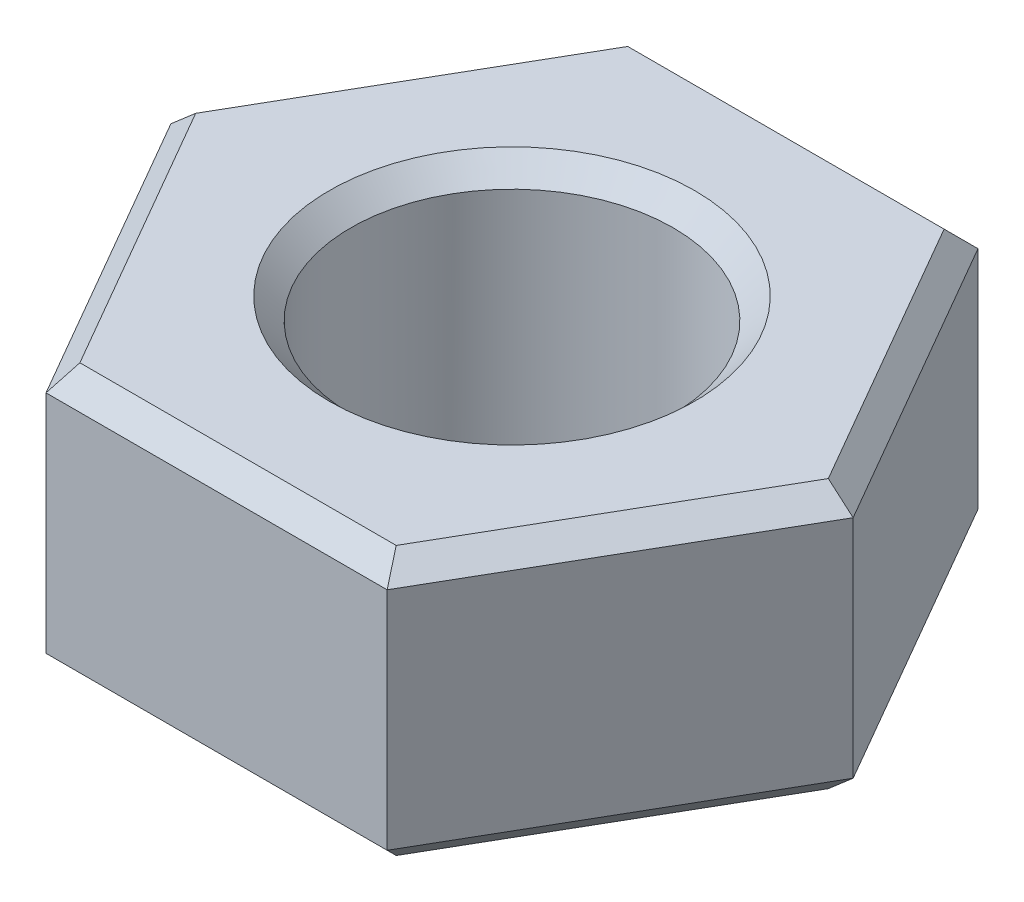
ISO-10303-21;
HEADER;
FILE_DESCRIPTION(('STEP AP214'),'2;1');
FILE_NAME('part.step','',(''),(''),'','','');
FILE_SCHEMA(('AUTOMOTIVE_DESIGN { 1 0 10303 214 1 1 1 1 }'));
ENDSEC;
DATA;
#1=APPLICATION_CONTEXT('core data for automotive mechanical design processes');
#2=APPLICATION_PROTOCOL_DEFINITION('international standard','automotive_design',2000,#1);
#3=PRODUCT_CONTEXT('',#1,'mechanical');
#4=PRODUCT('Part','Part','',(#3));
#5=PRODUCT_RELATED_PRODUCT_CATEGORY('part','',(#4));
#6=PRODUCT_DEFINITION_FORMATION('','',#4);
#7=PRODUCT_DEFINITION_CONTEXT('part definition',#1,'design');
#8=PRODUCT_DEFINITION('design','',#6,#7);
#9=PRODUCT_DEFINITION_SHAPE('','',#8);
#10=(LENGTH_UNIT() NAMED_UNIT(*) SI_UNIT(.MILLI.,.METRE.));
#11=(NAMED_UNIT(*) PLANE_ANGLE_UNIT() SI_UNIT($,.RADIAN.));
#12=(NAMED_UNIT(*) SI_UNIT($,.STERADIAN.) SOLID_ANGLE_UNIT());
#13=UNCERTAINTY_MEASURE_WITH_UNIT(LENGTH_MEASURE(1.E-05),#10,'distance_accuracy_value','');
#14=(GEOMETRIC_REPRESENTATION_CONTEXT(3) GLOBAL_UNCERTAINTY_ASSIGNED_CONTEXT((#13)) GLOBAL_UNIT_ASSIGNED_CONTEXT((#10,
#11,#12)) REPRESENTATION_CONTEXT('',''));
#15=CARTESIAN_POINT('',(0.,0.,0.));
#16=DIRECTION('',(0.,0.,1.));
#17=DIRECTION('',(1.,0.,0.));
#18=AXIS2_PLACEMENT_3D('',#15,#16,#17);
#19=CARTESIAN_POINT('',(0.,2.5,0.));
#20=DIRECTION('',(0.,1.,0.));
#21=DIRECTION('',(0.,0.,1.));
#22=AXIS2_PLACEMENT_3D('',#19,#20,#21);
#23=PLANE('',#22);
#24=CARTESIAN_POINT('',(0.,2.5,0.));
#25=DIRECTION('',(0.,1.,0.));
#26=DIRECTION('',(0.,0.,1.));
#27=AXIS2_PLACEMENT_3D('',#24,#25,#26);
#28=CIRCLE('',#27,1.7);
#29=CARTESIAN_POINT('',(0.,2.5,1.7));
#30=VERTEX_POINT('',#29);
#31=EDGE_CURVE('E11',#30,#30,#28,.F.);
#32=ORIENTED_EDGE('',*,*,#31,.T.);
#33=EDGE_LOOP('',(#32));
#34=FACE_BOUND('',#33,.T.);
#35=DIRECTION('',(0.500000000000007,0.,0.866025403784435));
#36=VECTOR('',#35,1.);
#37=CARTESIAN_POINT('',(-1.41450815951456,2.5,2.65000000000002));
#38=LINE('',#37,#36);
#39=CARTESIAN_POINT('',(-2.94448637286709,2.5,0.));
#40=VERTEX_POINT('',#39);
#41=CARTESIAN_POINT('',(-1.47224318643352,2.5,2.55000000000001));
#42=VERTEX_POINT('',#41);
#43=EDGE_CURVE('E49',#40,#42,#38,.T.);
#44=ORIENTED_EDGE('',*,*,#43,.T.);
#45=DIRECTION('',(1.,0.,0.));
#46=VECTOR('',#45,1.);
#47=CARTESIAN_POINT('',(1.5877132402715,2.5,2.54999999999998));
#48=LINE('',#47,#46);
#49=CARTESIAN_POINT('',(1.47224318643358,2.5,2.54999999999998));
#50=VERTEX_POINT('',#49);
#51=EDGE_CURVE('E41',#42,#50,#48,.T.);
#52=ORIENTED_EDGE('',*,*,#51,.T.);
#53=DIRECTION('',(0.499999999999995,0.,-0.866025403784442));
#54=VECTOR('',#53,1.);
#55=CARTESIAN_POINT('',(3.00222139978605,2.5,-0.099999999999999));
#56=LINE('',#55,#54);
#57=CARTESIAN_POINT('',(2.94448637286709,2.5,0.));
#58=VERTEX_POINT('',#57);
#59=EDGE_CURVE('E188',#50,#58,#56,.T.);
#60=ORIENTED_EDGE('',*,*,#59,.T.);
#61=DIRECTION('',(-0.500000000000001,0.,-0.866025403784438));
#62=VECTOR('',#61,1.);
#63=CARTESIAN_POINT('',(1.41450815951458,2.5,-2.65000000000001));
#64=LINE('',#63,#62);
#65=CARTESIAN_POINT('',(1.47224318643354,2.5,-2.55000000000001));
#66=VERTEX_POINT('',#65);
#67=EDGE_CURVE('E190',#58,#66,#64,.T.);
#68=ORIENTED_EDGE('',*,*,#67,.T.);
#69=DIRECTION('',(-1.,0.,0.));
#70=VECTOR('',#69,1.);
#71=CARTESIAN_POINT('',(-1.58771324027148,2.5,-2.54999999999999));
#72=LINE('',#71,#70);
#73=CARTESIAN_POINT('',(-1.47224318643356,2.5,-2.55));
#74=VERTEX_POINT('',#73);
#75=EDGE_CURVE('E192',#66,#74,#72,.T.);
#76=ORIENTED_EDGE('',*,*,#75,.T.);
#77=DIRECTION('',(-0.499999999999995,0.,0.866025403784441));
#78=VECTOR('',#77,1.);
#79=CARTESIAN_POINT('',(-3.00222139978606,2.5,0.100000000000021));
#80=LINE('',#79,#78);
#81=EDGE_CURVE('E54',#74,#40,#80,.T.);
#82=ORIENTED_EDGE('',*,*,#81,.T.);
#83=EDGE_LOOP('',(#44,#52,#60,#68,#76,#82));
#84=FACE_BOUND('',#83,.T.);
#85=ADVANCED_FACE('F32',(#34,#84),#23,.T.);
#86=CARTESIAN_POINT('',(0.,0.,0.));
#87=DIRECTION('',(0.,1.,0.));
#88=DIRECTION('',(0.,0.,1.));
#89=AXIS2_PLACEMENT_3D('',#86,#87,#88);
#90=PLANE('',#89);
#91=CARTESIAN_POINT('',(0.,0.,0.));
#92=DIRECTION('',(0.,1.,0.));
#93=DIRECTION('',(0.,0.,1.));
#94=AXIS2_PLACEMENT_3D('',#91,#92,#93);
#95=CIRCLE('',#94,1.7);
#96=CARTESIAN_POINT('',(0.,0.,-1.7));
#97=VERTEX_POINT('',#96);
#98=EDGE_CURVE('E150',#97,#97,#95,.T.);
#99=ORIENTED_EDGE('',*,*,#98,.T.);
#100=EDGE_LOOP('',(#99));
#101=FACE_BOUND('',#100,.T.);
#102=DIRECTION('',(1.,0.,0.));
#103=VECTOR('',#102,1.);
#104=CARTESIAN_POINT('',(0.,0.,-2.55));
#105=LINE('',#104,#103);
#106=CARTESIAN_POINT('',(-1.47224318643356,0.,-2.54999999999999));
#107=VERTEX_POINT('',#106);
#108=CARTESIAN_POINT('',(1.47224318643354,0.,-2.55));
#109=VERTEX_POINT('',#108);
#110=EDGE_CURVE('E149',#107,#109,#105,.T.);
#111=ORIENTED_EDGE('',*,*,#110,.T.);
#112=DIRECTION('',(0.500000000000001,0.,0.866025403784438));
#113=VECTOR('',#112,1.);
#114=CARTESIAN_POINT('',(2.20836477965032,0.,-1.275));
#115=LINE('',#114,#113);
#116=CARTESIAN_POINT('',(2.94448637286709,0.,0.));
#117=VERTEX_POINT('',#116);
#118=EDGE_CURVE('E128',#109,#117,#115,.T.);
#119=ORIENTED_EDGE('',*,*,#118,.T.);
#120=DIRECTION('',(-0.499999999999995,0.,0.866025403784442));
#121=VECTOR('',#120,1.);
#122=CARTESIAN_POINT('',(2.20836477965033,0.,1.27499999999999));
#123=LINE('',#122,#121);
#124=CARTESIAN_POINT('',(1.47224318643358,0.,2.54999999999998));
#125=VERTEX_POINT('',#124);
#126=EDGE_CURVE('E138',#117,#125,#123,.T.);
#127=ORIENTED_EDGE('',*,*,#126,.T.);
#128=DIRECTION('',(-1.,0.,0.));
#129=VECTOR('',#128,1.);
#130=CARTESIAN_POINT('',(0.,0.,2.55));
#131=LINE('',#130,#129);
#132=CARTESIAN_POINT('',(-1.47224318643352,0.,2.55000000000001));
#133=VERTEX_POINT('',#132);
#134=EDGE_CURVE('E144',#125,#133,#131,.T.);
#135=ORIENTED_EDGE('',*,*,#134,.T.);
#136=DIRECTION('',(-0.500000000000007,0.,-0.866025403784435));
#137=VECTOR('',#136,1.);
#138=CARTESIAN_POINT('',(-2.20836477965031,0.,1.27500000000002));
#139=LINE('',#138,#137);
#140=CARTESIAN_POINT('',(-2.94448637286709,0.,0.));
#141=VERTEX_POINT('',#140);
#142=EDGE_CURVE('E250',#133,#141,#139,.T.);
#143=ORIENTED_EDGE('',*,*,#142,.T.);
#144=DIRECTION('',(0.499999999999995,0.,-0.866025403784441));
#145=VECTOR('',#144,1.);
#146=CARTESIAN_POINT('',(-2.20836477965032,0.,-1.27499999999999));
#147=LINE('',#146,#145);
#148=EDGE_CURVE('E155',#141,#107,#147,.T.);
#149=ORIENTED_EDGE('',*,*,#148,.T.);
#150=EDGE_LOOP('',(#111,#119,#127,#135,#143,#149));
#151=FACE_BOUND('',#150,.T.);
#152=ADVANCED_FACE('F147',(#101,#151),#90,.F.);
#153=CARTESIAN_POINT('',(1.5877132402715,2.5,2.74999999999998));
#154=DIRECTION('',(-0.866025403784442,0.,-0.499999999999995));
#155=DIRECTION('',(-0.499999999999995,0.,0.866025403784442));
#156=AXIS2_PLACEMENT_3D('',#153,#154,#155);
#157=PLANE('',#156);
#158=DIRECTION('',(0.,-1.,0.));
#159=VECTOR('',#158,1.);
#160=CARTESIAN_POINT('',(1.5877132402715,2.5,2.74999999999998));
#161=LINE('',#160,#159);
#162=CARTESIAN_POINT('',(1.5877132402715,2.3,2.74999999999998));
#163=VERTEX_POINT('',#162);
#164=CARTESIAN_POINT('',(1.5877132402715,0.200000000000001,2.74999999999998));
#165=VERTEX_POINT('',#164);
#166=EDGE_CURVE('E207',#163,#165,#161,.T.);
#167=ORIENTED_EDGE('',*,*,#166,.T.);
#168=DIRECTION('',(0.499999999999995,0.,-0.866025403784442));
#169=VECTOR('',#168,1.);
#170=CARTESIAN_POINT('',(1.5877132402715,0.200000000000001,2.74999999999998));
#171=LINE('',#170,#169);
#172=CARTESIAN_POINT('',(3.17542648054294,0.200000000000001,0.));
#173=VERTEX_POINT('',#172);
#174=EDGE_CURVE('E186',#165,#173,#171,.T.);
#175=ORIENTED_EDGE('',*,*,#174,.T.);
#176=DIRECTION('',(0.,-1.,0.));
#177=VECTOR('',#176,1.);
#178=CARTESIAN_POINT('',(3.17542648054294,2.5,0.));
#179=LINE('',#178,#177);
#180=CARTESIAN_POINT('',(3.17542648054294,2.3,0.));
#181=VERTEX_POINT('',#180);
#182=EDGE_CURVE('E145',#181,#173,#179,.T.);
#183=ORIENTED_EDGE('',*,*,#182,.F.);
#184=DIRECTION('',(-0.499999999999995,0.,0.866025403784442));
#185=VECTOR('',#184,1.);
#186=CARTESIAN_POINT('',(1.5877132402715,2.3,2.74999999999998));
#187=LINE('',#186,#185);
#188=EDGE_CURVE('E184',#181,#163,#187,.T.);
#189=ORIENTED_EDGE('',*,*,#188,.T.);
#190=EDGE_LOOP('',(#167,#175,#183,#189));
#191=FACE_BOUND('',#190,.T.);
#192=ADVANCED_FACE('F274',(#191),#157,.F.);
#193=CARTESIAN_POINT('',(3.17542648054294,2.5,0.));
#194=DIRECTION('',(-0.866025403784438,0.,0.500000000000001));
#195=DIRECTION('',(0.500000000000001,0.,0.866025403784438));
#196=AXIS2_PLACEMENT_3D('',#193,#194,#195);
#197=PLANE('',#196);
#198=ORIENTED_EDGE('',*,*,#182,.T.);
#199=DIRECTION('',(-0.500000000000001,0.,-0.866025403784438));
#200=VECTOR('',#199,1.);
#201=CARTESIAN_POINT('',(3.17542648054294,0.200000000000001,0.));
#202=LINE('',#201,#200);
#203=CARTESIAN_POINT('',(1.58771324027147,0.200000000000001,-2.75));
#204=VERTEX_POINT('',#203);
#205=EDGE_CURVE('E131',#173,#204,#202,.T.);
#206=ORIENTED_EDGE('',*,*,#205,.T.);
#207=DIRECTION('',(0.,-1.,0.));
#208=VECTOR('',#207,1.);
#209=CARTESIAN_POINT('',(1.58771324027147,2.5,-2.75));
#210=LINE('',#209,#208);
#211=CARTESIAN_POINT('',(1.58771324027147,2.3,-2.75));
#212=VERTEX_POINT('',#211);
#213=EDGE_CURVE('E236',#212,#204,#210,.T.);
#214=ORIENTED_EDGE('',*,*,#213,.F.);
#215=DIRECTION('',(0.500000000000001,0.,0.866025403784438));
#216=VECTOR('',#215,1.);
#217=CARTESIAN_POINT('',(3.17542648054294,2.3,0.));
#218=LINE('',#217,#216);
#219=EDGE_CURVE('E164',#212,#181,#218,.T.);
#220=ORIENTED_EDGE('',*,*,#219,.T.);
#221=EDGE_LOOP('',(#198,#206,#214,#220));
#222=FACE_BOUND('',#221,.T.);
#223=ADVANCED_FACE('F241',(#222),#197,.F.);
#224=CARTESIAN_POINT('',(1.58771324027147,2.5,-2.75));
#225=DIRECTION('',(0.,0.,1.));
#226=DIRECTION('',(1.,0.,0.));
#227=AXIS2_PLACEMENT_3D('',#224,#225,#226);
#228=PLANE('',#227);
#229=ORIENTED_EDGE('',*,*,#213,.T.);
#230=DIRECTION('',(-1.,0.,0.));
#231=VECTOR('',#230,1.);
#232=CARTESIAN_POINT('',(1.58771324027147,0.200000000000001,-2.75));
#233=LINE('',#232,#231);
#234=CARTESIAN_POINT('',(-1.58771324027148,0.200000000000001,-2.74999999999999));
#235=VERTEX_POINT('',#234);
#236=EDGE_CURVE('E169',#204,#235,#233,.T.);
#237=ORIENTED_EDGE('',*,*,#236,.T.);
#238=DIRECTION('',(0.,-1.,0.));
#239=VECTOR('',#238,1.);
#240=CARTESIAN_POINT('',(-1.58771324027148,2.5,-2.74999999999999));
#241=LINE('',#240,#239);
#242=CARTESIAN_POINT('',(-1.58771324027148,2.3,-2.74999999999999));
#243=VERTEX_POINT('',#242);
#244=EDGE_CURVE('E238',#243,#235,#241,.T.);
#245=ORIENTED_EDGE('',*,*,#244,.F.);
#246=DIRECTION('',(1.,0.,0.));
#247=VECTOR('',#246,1.);
#248=CARTESIAN_POINT('',(1.58771324027147,2.3,-2.75));
#249=LINE('',#248,#247);
#250=EDGE_CURVE('E167',#243,#212,#249,.T.);
#251=ORIENTED_EDGE('',*,*,#250,.T.);
#252=EDGE_LOOP('',(#229,#237,#245,#251));
#253=FACE_BOUND('',#252,.T.);
#254=ADVANCED_FACE('F235',(#253),#228,.F.);
#255=CARTESIAN_POINT('',(-1.58771324027148,2.5,-2.74999999999999));
#256=DIRECTION('',(0.866025403784442,0.,0.499999999999995));
#257=DIRECTION('',(0.499999999999995,0.,-0.866025403784442));
#258=AXIS2_PLACEMENT_3D('',#255,#256,#257);
#259=PLANE('',#258);
#260=ORIENTED_EDGE('',*,*,#244,.T.);
#261=DIRECTION('',(-0.499999999999995,0.,0.866025403784442));
#262=VECTOR('',#261,1.);
#263=CARTESIAN_POINT('',(-1.58771324027148,0.200000000000001,-2.74999999999999));
#264=LINE('',#263,#262);
#265=CARTESIAN_POINT('',(-3.17542648054294,0.200000000000001,0.));
#266=VERTEX_POINT('',#265);
#267=EDGE_CURVE('E173',#235,#266,#264,.T.);
#268=ORIENTED_EDGE('',*,*,#267,.T.);
#269=DIRECTION('',(0.,-1.,0.));
#270=VECTOR('',#269,1.);
#271=CARTESIAN_POINT('',(-3.17542648054294,2.5,0.));
#272=LINE('',#271,#270);
#273=CARTESIAN_POINT('',(-3.17542648054294,2.3,0.));
#274=VERTEX_POINT('',#273);
#275=EDGE_CURVE('E245',#274,#266,#272,.T.);
#276=ORIENTED_EDGE('',*,*,#275,.F.);
#277=DIRECTION('',(0.499999999999995,0.,-0.866025403784442));
#278=VECTOR('',#277,1.);
#279=CARTESIAN_POINT('',(-1.58771324027148,2.3,-2.74999999999999));
#280=LINE('',#279,#278);
#281=EDGE_CURVE('E171',#274,#243,#280,.T.);
#282=ORIENTED_EDGE('',*,*,#281,.T.);
#283=EDGE_LOOP('',(#260,#268,#276,#282));
#284=FACE_BOUND('',#283,.T.);
#285=ADVANCED_FACE('F262',(#284),#259,.F.);
#286=CARTESIAN_POINT('',(-3.17542648054294,2.5,0.));
#287=DIRECTION('',(0.866025403784435,0.,-0.500000000000007));
#288=DIRECTION('',(-0.500000000000007,0.,-0.866025403784435));
#289=AXIS2_PLACEMENT_3D('',#286,#287,#288);
#290=PLANE('',#289);
#291=ORIENTED_EDGE('',*,*,#275,.T.);
#292=DIRECTION('',(0.500000000000007,0.,0.866025403784435));
#293=VECTOR('',#292,1.);
#294=CARTESIAN_POINT('',(-3.17542648054294,0.200000000000001,0.));
#295=LINE('',#294,#293);
#296=CARTESIAN_POINT('',(-1.58771324027145,0.200000000000001,2.75000000000002));
#297=VERTEX_POINT('',#296);
#298=EDGE_CURVE('E177',#266,#297,#295,.T.);
#299=ORIENTED_EDGE('',*,*,#298,.T.);
#300=DIRECTION('',(0.,-1.,0.));
#301=VECTOR('',#300,1.);
#302=CARTESIAN_POINT('',(-1.58771324027145,2.5,2.75000000000002));
#303=LINE('',#302,#301);
#304=CARTESIAN_POINT('',(-1.58771324027145,2.3,2.75000000000002));
#305=VERTEX_POINT('',#304);
#306=EDGE_CURVE('E267',#305,#297,#303,.T.);
#307=ORIENTED_EDGE('',*,*,#306,.F.);
#308=DIRECTION('',(-0.500000000000007,0.,-0.866025403784435));
#309=VECTOR('',#308,1.);
#310=CARTESIAN_POINT('',(-3.17542648054294,2.3,0.));
#311=LINE('',#310,#309);
#312=EDGE_CURVE('E175',#305,#274,#311,.T.);
#313=ORIENTED_EDGE('',*,*,#312,.T.);
#314=EDGE_LOOP('',(#291,#299,#307,#313));
#315=FACE_BOUND('',#314,.T.);
#316=ADVANCED_FACE('F285',(#315),#290,.F.);
#317=CARTESIAN_POINT('',(-1.58771324027145,2.5,2.75000000000002));
#318=DIRECTION('',(0.,0.,-1.));
#319=DIRECTION('',(-1.,0.,0.));
#320=AXIS2_PLACEMENT_3D('',#317,#318,#319);
#321=PLANE('',#320);
#322=ORIENTED_EDGE('',*,*,#306,.T.);
#323=DIRECTION('',(1.,0.,0.));
#324=VECTOR('',#323,1.);
#325=CARTESIAN_POINT('',(-1.58771324027145,0.200000000000001,2.75000000000002));
#326=LINE('',#325,#324);
#327=EDGE_CURVE('E182',#297,#165,#326,.T.);
#328=ORIENTED_EDGE('',*,*,#327,.T.);
#329=ORIENTED_EDGE('',*,*,#166,.F.);
#330=DIRECTION('',(-1.,0.,0.));
#331=VECTOR('',#330,1.);
#332=CARTESIAN_POINT('',(-1.58771324027145,2.3,2.75000000000002));
#333=LINE('',#332,#331);
#334=EDGE_CURVE('E179',#163,#305,#333,.T.);
#335=ORIENTED_EDGE('',*,*,#334,.T.);
#336=EDGE_LOOP('',(#322,#328,#329,#335));
#337=FACE_BOUND('',#336,.T.);
#338=ADVANCED_FACE('F286',(#337),#321,.F.);
#339=CARTESIAN_POINT('',(0.,2.5,0.));
#340=DIRECTION('',(0.,-1.,0.));
#341=DIRECTION('',(0.,0.,-1.));
#342=AXIS2_PLACEMENT_3D('',#339,#340,#341);
#343=CYLINDRICAL_SURFACE('',#342,1.5);
#344=CARTESIAN_POINT('',(0.,0.199999999999999,0.));
#345=DIRECTION('',(0.,1.,0.));
#346=DIRECTION('',(0.,0.,1.));
#347=AXIS2_PLACEMENT_3D('',#344,#345,#346);
#348=CIRCLE('',#347,1.5);
#349=CARTESIAN_POINT('',(0.,0.199999999999999,-1.5));
#350=VERTEX_POINT('',#349);
#351=EDGE_CURVE('E161',#350,#350,#348,.F.);
#352=ORIENTED_EDGE('',*,*,#351,.T.);
#353=EDGE_LOOP('',(#352));
#354=FACE_BOUND('',#353,.T.);
#355=CARTESIAN_POINT('',(0.,2.3,0.));
#356=DIRECTION('',(0.,1.,0.));
#357=DIRECTION('',(0.,0.,1.));
#358=AXIS2_PLACEMENT_3D('',#355,#356,#357);
#359=CIRCLE('',#358,1.5);
#360=CARTESIAN_POINT('',(0.,2.3,1.5));
#361=VERTEX_POINT('',#360);
#362=EDGE_CURVE('E153',#361,#361,#359,.T.);
#363=ORIENTED_EDGE('',*,*,#362,.T.);
#364=EDGE_LOOP('',(#363));
#365=FACE_BOUND('',#364,.T.);
#366=ADVANCED_FACE('F305',(#354,#365),#343,.F.);
#367=CARTESIAN_POINT('',(0.,0.,0.));
#368=DIRECTION('',(0.,-1.,0.));
#369=DIRECTION('',(0.,0.,-1.));
#370=AXIS2_PLACEMENT_3D('',#367,#368,#369);
#371=CONICAL_SURFACE('',#370,1.7,0.785398163397448);
#372=CARTESIAN_POINT('',(0.,0.199999999999999,-1.5));
#373=CARTESIAN_POINT('',(0.,0.197916666666666,-1.50208333333333));
#374=CARTESIAN_POINT('',(0.,0.195833333333333,-1.50416666666667));
#375=CARTESIAN_POINT('',(0.,0.191666666666666,-1.50833333333333));
#376=CARTESIAN_POINT('',(0.,0.189583333333333,-1.51041666666667));
#377=CARTESIAN_POINT('',(0.,0.185416666666666,-1.51458333333333));
#378=CARTESIAN_POINT('',(0.,0.183333333333333,-1.51666666666667));
#379=CARTESIAN_POINT('',(0.,0.179166666666666,-1.52083333333333));
#380=CARTESIAN_POINT('',(0.,0.177083333333333,-1.52291666666667));
#381=CARTESIAN_POINT('',(0.,0.172916666666666,-1.52708333333333));
#382=CARTESIAN_POINT('',(0.,0.170833333333333,-1.52916666666667));
#383=CARTESIAN_POINT('',(0.,0.166666666666666,-1.53333333333333));
#384=CARTESIAN_POINT('',(0.,0.164583333333333,-1.53541666666667));
#385=CARTESIAN_POINT('',(0.,0.160416666666666,-1.53958333333333));
#386=CARTESIAN_POINT('',(0.,0.158333333333333,-1.54166666666667));
#387=CARTESIAN_POINT('',(0.,0.154166666666666,-1.54583333333333));
#388=CARTESIAN_POINT('',(0.,0.152083333333333,-1.54791666666667));
#389=CARTESIAN_POINT('',(0.,0.147916666666666,-1.55208333333333));
#390=CARTESIAN_POINT('',(0.,0.145833333333333,-1.55416666666667));
#391=CARTESIAN_POINT('',(0.,0.141666666666666,-1.55833333333333));
#392=CARTESIAN_POINT('',(0.,0.139583333333333,-1.56041666666667));
#393=CARTESIAN_POINT('',(0.,0.135416666666666,-1.56458333333333));
#394=CARTESIAN_POINT('',(0.,0.133333333333333,-1.56666666666667));
#395=CARTESIAN_POINT('',(0.,0.129166666666666,-1.57083333333333));
#396=CARTESIAN_POINT('',(0.,0.127083333333333,-1.57291666666667));
#397=CARTESIAN_POINT('',(0.,0.122916666666666,-1.57708333333333));
#398=CARTESIAN_POINT('',(0.,0.120833333333333,-1.57916666666667));
#399=CARTESIAN_POINT('',(0.,0.116666666666666,-1.58333333333333));
#400=CARTESIAN_POINT('',(0.,0.114583333333333,-1.58541666666667));
#401=CARTESIAN_POINT('',(0.,0.110416666666666,-1.58958333333333));
#402=CARTESIAN_POINT('',(0.,0.108333333333333,-1.59166666666667));
#403=CARTESIAN_POINT('',(0.,0.104166666666666,-1.59583333333333));
#404=CARTESIAN_POINT('',(0.,0.102083333333333,-1.59791666666667));
#405=CARTESIAN_POINT('',(0.,0.0979166666666663,-1.60208333333333));
#406=CARTESIAN_POINT('',(0.,0.095833333333333,-1.60416666666667));
#407=CARTESIAN_POINT('',(0.,0.0916666666666663,-1.60833333333333));
#408=CARTESIAN_POINT('',(0.,0.089583333333333,-1.61041666666667));
#409=CARTESIAN_POINT('',(0.,0.0854166666666663,-1.61458333333333));
#410=CARTESIAN_POINT('',(0.,0.083333333333333,-1.61666666666667));
#411=CARTESIAN_POINT('',(0.,0.0791666666666663,-1.62083333333333));
#412=CARTESIAN_POINT('',(0.,0.077083333333333,-1.62291666666667));
#413=CARTESIAN_POINT('',(0.,0.0729166666666664,-1.62708333333333));
#414=CARTESIAN_POINT('',(0.,0.0708333333333331,-1.62916666666667));
#415=CARTESIAN_POINT('',(0.,0.0666666666666664,-1.63333333333333));
#416=CARTESIAN_POINT('',(0.,0.0645833333333331,-1.63541666666667));
#417=CARTESIAN_POINT('',(0.,0.0604166666666664,-1.63958333333333));
#418=CARTESIAN_POINT('',(0.,0.0583333333333331,-1.64166666666667));
#419=CARTESIAN_POINT('',(0.,0.0541666666666664,-1.64583333333333));
#420=CARTESIAN_POINT('',(0.,0.0520833333333331,-1.64791666666667));
#421=CARTESIAN_POINT('',(0.,0.0479166666666665,-1.65208333333333));
#422=CARTESIAN_POINT('',(0.,0.0458333333333332,-1.65416666666667));
#423=CARTESIAN_POINT('',(0.,0.0416666666666665,-1.65833333333333));
#424=CARTESIAN_POINT('',(0.,0.0395833333333332,-1.66041666666667));
#425=CARTESIAN_POINT('',(0.,0.0354166666666665,-1.66458333333333));
#426=CARTESIAN_POINT('',(0.,0.0333333333333332,-1.66666666666667));
#427=CARTESIAN_POINT('',(0.,0.0291666666666665,-1.67083333333333));
#428=CARTESIAN_POINT('',(0.,0.0270833333333332,-1.67291666666667));
#429=CARTESIAN_POINT('',(0.,0.0229166666666666,-1.67708333333333));
#430=CARTESIAN_POINT('',(0.,0.0208333333333333,-1.67916666666667));
#431=CARTESIAN_POINT('',(0.,0.0166666666666666,-1.68333333333333));
#432=CARTESIAN_POINT('',(0.,0.0145833333333333,-1.68541666666667));
#433=CARTESIAN_POINT('',(0.,0.0104166666666666,-1.68958333333333));
#434=CARTESIAN_POINT('',(0.,0.00833333333333329,-1.69166666666667));
#435=CARTESIAN_POINT('',(0.,0.00416666666666664,-1.69583333333333));
#436=CARTESIAN_POINT('',(0.,0.00208333333333332,-1.69791666666667));
#437=CARTESIAN_POINT('',(0.,0.,-1.7));
#438=B_SPLINE_CURVE_WITH_KNOTS('',3,(#372,#373,#374,#375,#376,#377,#378,#379,#380,#381,#382,
#383,#384,#385,#386,#387,#388,#389,#390,#391,#392,#393,#394,#395,#396,#397,#398,#399,#400,#401,
#402,#403,#404,#405,#406,#407,#408,#409,#410,#411,#412,#413,#414,#415,#416,#417,#418,#419,#420,
#421,#422,#423,#424,#425,#426,#427,#428,#429,#430,#431,#432,#433,#434,#435,#436,#437),
.UNSPECIFIED.,.F.,.F.,(4,2,2,2,2,2,2,2,2,2,2,2,2,2,2,2,2,2,2,2,2,2,2,2,2,2,2,2,2,2,2,2,4),(0.,
0.00883883476483179,0.0176776695296636,0.0265165042944954,0.0353553390593272,0.044194173824159,
0.0530330085889908,0.0618718433538226,0.0707106781186544,0.0795495128834862,0.088388347648318,
0.0972271824131498,0.106066017177982,0.114904851942813,0.123743686707645,0.132582521472477,
0.141421356237309,0.150260191002141,0.159099025766973,0.167937860531804,0.176776695296636,
0.185615530061468,0.1944543648263,0.203293199591132,0.212132034355963,0.220970869120795,
0.229809703885627,0.238648538650459,0.247487373415291,0.256326208180122,0.265165042944954,
0.274003877709786,0.282842712474618),.UNSPECIFIED.);
#439=EDGE_CURVE('BSEAM319',#350,#97,#438,.T.);
#440=ORIENTED_EDGE('',*,*,#351,.F.);
#441=ORIENTED_EDGE('',*,*,#98,.F.);
#442=ORIENTED_EDGE('',*,*,#439,.T.);
#443=ORIENTED_EDGE('',*,*,#439,.F.);
#444=EDGE_LOOP('',(#440,#442,#441,#443));
#445=FACE_BOUND('',#444,.T.);
#446=ADVANCED_FACE('F319',(#445),#371,.F.);
#447=CARTESIAN_POINT('',(-3.17542648054294,0.200000000000001,0.));
#448=DIRECTION('',(0.612372435695791,0.707106781186548,-0.353553390593279));
#449=DIRECTION('',(0.500000000000007,0.,0.866025403784435));
#450=AXIS2_PLACEMENT_3D('',#447,#448,#449);
#451=PLANE('',#450);
#452=DIRECTION('',(0.755928946018455,-0.654653670707976,0.));
#453=VECTOR('',#452,1.);
#454=CARTESIAN_POINT('',(-3.17542648054294,0.200000000000001,0.));
#455=LINE('',#454,#453);
#456=EDGE_CURVE('E201',#141,#266,#455,.F.);
#457=ORIENTED_EDGE('',*,*,#456,.F.);
#458=ORIENTED_EDGE('',*,*,#142,.F.);
#459=DIRECTION('',(0.377964473009219,-0.654653670707976,-0.654653670707983));
#460=VECTOR('',#459,1.);
#461=CARTESIAN_POINT('',(-1.58771324027145,0.200000000000001,2.75000000000002));
#462=LINE('',#461,#460);
#463=EDGE_CURVE('E204',#297,#133,#462,.T.);
#464=ORIENTED_EDGE('',*,*,#463,.F.);
#465=ORIENTED_EDGE('',*,*,#298,.F.);
#466=EDGE_LOOP('',(#457,#458,#464,#465));
#467=FACE_BOUND('',#466,.T.);
#468=ADVANCED_FACE('F283',(#467),#451,.F.);
#469=CARTESIAN_POINT('',(-1.58771324027145,0.200000000000001,2.75000000000002));
#470=DIRECTION('',(0.,0.707106781186549,-0.707106781186546));
#471=DIRECTION('',(1.,0.,0.));
#472=AXIS2_PLACEMENT_3D('',#469,#470,#471);
#473=PLANE('',#472);
#474=ORIENTED_EDGE('',*,*,#463,.T.);
#475=ORIENTED_EDGE('',*,*,#134,.F.);
#476=DIRECTION('',(-0.377964473009232,-0.654653670707976,-0.654653670707975));
#477=VECTOR('',#476,1.);
#478=CARTESIAN_POINT('',(1.5877132402715,0.200000000000001,2.74999999999998));
#479=LINE('',#478,#477);
#480=EDGE_CURVE('E141',#165,#125,#479,.T.);
#481=ORIENTED_EDGE('',*,*,#480,.F.);
#482=ORIENTED_EDGE('',*,*,#327,.F.);
#483=EDGE_LOOP('',(#474,#475,#481,#482));
#484=FACE_BOUND('',#483,.T.);
#485=ADVANCED_FACE('F280',(#484),#473,.F.);
#486=CARTESIAN_POINT('',(-1.58771324027148,0.200000000000001,-2.74999999999999));
#487=DIRECTION('',(0.612372435695796,0.707106781186549,0.35355339059327));
#488=DIRECTION('',(-0.499999999999995,0.,0.866025403784442));
#489=AXIS2_PLACEMENT_3D('',#486,#487,#488);
#490=PLANE('',#489);
#491=ORIENTED_EDGE('',*,*,#456,.T.);
#492=ORIENTED_EDGE('',*,*,#267,.F.);
#493=DIRECTION('',(0.377964473009231,-0.654653670707976,0.654653670707977));
#494=VECTOR('',#493,1.);
#495=CARTESIAN_POINT('',(-1.58771324027148,0.200000000000001,-2.74999999999999));
#496=LINE('',#495,#494);
#497=EDGE_CURVE('E134',#107,#235,#496,.F.);
#498=ORIENTED_EDGE('',*,*,#497,.F.);
#499=ORIENTED_EDGE('',*,*,#148,.F.);
#500=EDGE_LOOP('',(#491,#492,#498,#499));
#501=FACE_BOUND('',#500,.T.);
#502=ADVANCED_FACE('F257',(#501),#490,.F.);
#503=CARTESIAN_POINT('',(1.5877132402715,0.200000000000001,2.74999999999998));
#504=DIRECTION('',(-0.612372435695796,0.707106781186549,-0.35355339059327));
#505=DIRECTION('',(0.499999999999995,0.,-0.866025403784442));
#506=AXIS2_PLACEMENT_3D('',#503,#504,#505);
#507=PLANE('',#506);
#508=ORIENTED_EDGE('',*,*,#480,.T.);
#509=ORIENTED_EDGE('',*,*,#126,.F.);
#510=DIRECTION('',(0.755928946018455,0.654653670707977,0.));
#511=VECTOR('',#510,1.);
#512=CARTESIAN_POINT('',(2.26816177181641,-0.58571428571427,0.));
#513=LINE('',#512,#511);
#514=EDGE_CURVE('E124',#173,#117,#513,.F.);
#515=ORIENTED_EDGE('',*,*,#514,.F.);
#516=ORIENTED_EDGE('',*,*,#174,.F.);
#517=EDGE_LOOP('',(#508,#509,#515,#516));
#518=FACE_BOUND('',#517,.T.);
#519=ADVANCED_FACE('F139',(#518),#507,.F.);
#520=CARTESIAN_POINT('',(1.58771324027147,0.200000000000001,-2.75));
#521=DIRECTION('',(0.,0.707106781186549,0.707106781186546));
#522=DIRECTION('',(-1.,0.,0.));
#523=AXIS2_PLACEMENT_3D('',#520,#521,#522);
#524=PLANE('',#523);
#525=ORIENTED_EDGE('',*,*,#497,.T.);
#526=ORIENTED_EDGE('',*,*,#236,.F.);
#527=DIRECTION('',(-0.377964473009224,-0.654653670707976,0.65465367070798));
#528=VECTOR('',#527,1.);
#529=CARTESIAN_POINT('',(1.58771324027147,0.200000000000001,-2.75));
#530=LINE('',#529,#528);
#531=EDGE_CURVE('E135',#109,#204,#530,.F.);
#532=ORIENTED_EDGE('',*,*,#531,.F.);
#533=ORIENTED_EDGE('',*,*,#110,.F.);
#534=EDGE_LOOP('',(#525,#526,#532,#533));
#535=FACE_BOUND('',#534,.T.);
#536=ADVANCED_FACE('F260',(#535),#524,.F.);
#537=CARTESIAN_POINT('',(3.17542648054294,0.200000000000001,0.));
#538=DIRECTION('',(-0.612372435695794,0.707106781186547,0.353553390593274));
#539=DIRECTION('',(-0.500000000000001,0.,-0.866025403784438));
#540=AXIS2_PLACEMENT_3D('',#537,#538,#539);
#541=PLANE('',#540);
#542=ORIENTED_EDGE('',*,*,#514,.T.);
#543=ORIENTED_EDGE('',*,*,#118,.F.);
#544=ORIENTED_EDGE('',*,*,#531,.T.);
#545=ORIENTED_EDGE('',*,*,#205,.F.);
#546=EDGE_LOOP('',(#542,#543,#544,#545));
#547=FACE_BOUND('',#546,.T.);
#548=ADVANCED_FACE('F126',(#547),#541,.F.);
#549=CARTESIAN_POINT('',(0.,2.3,0.));
#550=DIRECTION('',(0.,1.,0.));
#551=DIRECTION('',(0.,0.,1.));
#552=AXIS2_PLACEMENT_3D('',#549,#550,#551);
#553=CONICAL_SURFACE('',#552,1.5,0.785398163397451);
#554=ORIENTED_EDGE('',*,*,#31,.F.);
#555=EDGE_LOOP('',(#554));
#556=FACE_BOUND('',#555,.T.);
#557=ORIENTED_EDGE('',*,*,#362,.F.);
#558=EDGE_LOOP('',(#557));
#559=FACE_BOUND('',#558,.T.);
#560=ADVANCED_FACE('F325',(#556,#559),#553,.F.);
#561=CARTESIAN_POINT('',(0.,2.5,-2.55));
#562=DIRECTION('',(0.,0.707106781186546,-0.707106781186549));
#563=DIRECTION('',(1.,0.,0.));
#564=AXIS2_PLACEMENT_3D('',#561,#562,#563);
#565=PLANE('',#564);
#566=DIRECTION('',(-0.377964473009225,0.654653670707979,0.654653670707977));
#567=VECTOR('',#566,1.);
#568=CARTESIAN_POINT('',(1.26192273122875,2.86428571428572,-2.18571428571429));
#569=LINE('',#568,#567);
#570=EDGE_CURVE('E217',#212,#66,#569,.T.);
#571=ORIENTED_EDGE('',*,*,#570,.F.);
#572=ORIENTED_EDGE('',*,*,#250,.F.);
#573=DIRECTION('',(0.37796447300923,0.654653670707979,0.654653670707974));
#574=VECTOR('',#573,1.);
#575=CARTESIAN_POINT('',(-1.26192273122876,2.86428571428572,-2.18571428571428));
#576=LINE('',#575,#574);
#577=EDGE_CURVE('E36',#74,#243,#576,.F.);
#578=ORIENTED_EDGE('',*,*,#577,.F.);
#579=ORIENTED_EDGE('',*,*,#75,.F.);
#580=EDGE_LOOP('',(#571,#572,#578,#579));
#581=FACE_BOUND('',#580,.T.);
#582=ADVANCED_FACE('F34',(#581),#565,.T.);
#583=CARTESIAN_POINT('',(-2.20836477965033,2.5,-1.27499999999999));
#584=DIRECTION('',(-0.612372435695798,0.707106781186546,-0.353553390593271));
#585=DIRECTION('',(0.499999999999995,0.,-0.866025403784442));
#586=AXIS2_PLACEMENT_3D('',#583,#584,#585);
#587=PLANE('',#586);
#588=ORIENTED_EDGE('',*,*,#577,.T.);
#589=ORIENTED_EDGE('',*,*,#281,.F.);
#590=DIRECTION('',(0.755928946018453,0.654653670707978,0.));
#591=VECTOR('',#590,1.);
#592=CARTESIAN_POINT('',(-2.52384546245751,2.86428571428572,0.));
#593=LINE('',#592,#591);
#594=EDGE_CURVE('E215',#40,#274,#593,.F.);
#595=ORIENTED_EDGE('',*,*,#594,.F.);
#596=ORIENTED_EDGE('',*,*,#81,.F.);
#597=EDGE_LOOP('',(#588,#589,#595,#596));
#598=FACE_BOUND('',#597,.T.);
#599=ADVANCED_FACE('F227',(#598),#587,.T.);
#600=CARTESIAN_POINT('',(2.20836477965032,2.5,-1.275));
#601=DIRECTION('',(0.612372435695796,0.707106781186545,-0.353553390593276));
#602=DIRECTION('',(0.500000000000001,0.,0.866025403784438));
#603=AXIS2_PLACEMENT_3D('',#600,#601,#602);
#604=PLANE('',#603);
#605=ORIENTED_EDGE('',*,*,#570,.T.);
#606=ORIENTED_EDGE('',*,*,#67,.F.);
#607=DIRECTION('',(-0.755928946018453,0.654653670707979,0.));
#608=VECTOR('',#607,1.);
#609=CARTESIAN_POINT('',(2.52384546245752,2.86428571428571,0.));
#610=LINE('',#609,#608);
#611=EDGE_CURVE('E212',#181,#58,#610,.T.);
#612=ORIENTED_EDGE('',*,*,#611,.F.);
#613=ORIENTED_EDGE('',*,*,#219,.F.);
#614=EDGE_LOOP('',(#605,#606,#612,#613));
#615=FACE_BOUND('',#614,.T.);
#616=ADVANCED_FACE('F346',(#615),#604,.T.);
#617=CARTESIAN_POINT('',(-2.20836477965031,2.5,1.27500000000002));
#618=DIRECTION('',(-0.612372435695793,0.707106781186546,0.353553390593279));
#619=DIRECTION('',(-0.500000000000007,0.,-0.866025403784435));
#620=AXIS2_PLACEMENT_3D('',#617,#618,#619);
#621=PLANE('',#620);
#622=ORIENTED_EDGE('',*,*,#594,.T.);
#623=ORIENTED_EDGE('',*,*,#312,.F.);
#624=DIRECTION('',(0.37796447300922,0.654653670707978,-0.65465367070798));
#625=VECTOR('',#624,1.);
#626=CARTESIAN_POINT('',(-1.26192273122873,2.86428571428572,2.1857142857143));
#627=LINE('',#626,#625);
#628=EDGE_CURVE('E210',#42,#305,#627,.F.);
#629=ORIENTED_EDGE('',*,*,#628,.F.);
#630=ORIENTED_EDGE('',*,*,#43,.F.);
#631=EDGE_LOOP('',(#622,#623,#629,#630));
#632=FACE_BOUND('',#631,.T.);
#633=ADVANCED_FACE('F343',(#632),#621,.T.);
#634=CARTESIAN_POINT('',(2.20836477965033,2.5,1.27499999999999));
#635=DIRECTION('',(0.612372435695797,0.707106781186547,0.35355339059327));
#636=DIRECTION('',(-0.499999999999995,0.,0.866025403784442));
#637=AXIS2_PLACEMENT_3D('',#634,#635,#636);
#638=PLANE('',#637);
#639=ORIENTED_EDGE('',*,*,#611,.T.);
#640=ORIENTED_EDGE('',*,*,#59,.F.);
#641=DIRECTION('',(0.377964473009233,-0.654653670707978,0.654653670707973));
#642=VECTOR('',#641,1.);
#643=CARTESIAN_POINT('',(1.26192273122878,2.86428571428571,2.18571428571428));
#644=LINE('',#643,#642);
#645=EDGE_CURVE('E208',#163,#50,#644,.F.);
#646=ORIENTED_EDGE('',*,*,#645,.F.);
#647=ORIENTED_EDGE('',*,*,#188,.F.);
#648=EDGE_LOOP('',(#639,#640,#646,#647));
#649=FACE_BOUND('',#648,.T.);
#650=ADVANCED_FACE('F294',(#649),#638,.T.);
#651=CARTESIAN_POINT('',(0.,2.5,2.55));
#652=DIRECTION('',(0.,0.707106781186547,0.707106781186548));
#653=DIRECTION('',(-1.,0.,0.));
#654=AXIS2_PLACEMENT_3D('',#651,#652,#653);
#655=PLANE('',#654);
#656=ORIENTED_EDGE('',*,*,#628,.T.);
#657=ORIENTED_EDGE('',*,*,#334,.F.);
#658=ORIENTED_EDGE('',*,*,#645,.T.);
#659=ORIENTED_EDGE('',*,*,#51,.F.);
#660=EDGE_LOOP('',(#656,#657,#658,#659));
#661=FACE_BOUND('',#660,.T.);
#662=ADVANCED_FACE('F289',(#661),#655,.T.);
#663=CLOSED_SHELL('',(#85,#152,#192,#223,#254,#285,#316,#338,#366,#446,#468,#485,#502,#519,#536,
#548,#560,#582,#599,#616,#633,#650,#662));
#664=MANIFOLD_SOLID_BREP('B2',#663);
#665=ADVANCED_BREP_SHAPE_REPRESENTATION('',(#18,#664),#14);
#666=SHAPE_DEFINITION_REPRESENTATION(#9,#665);
ENDSEC;
END-ISO-10303-21;
